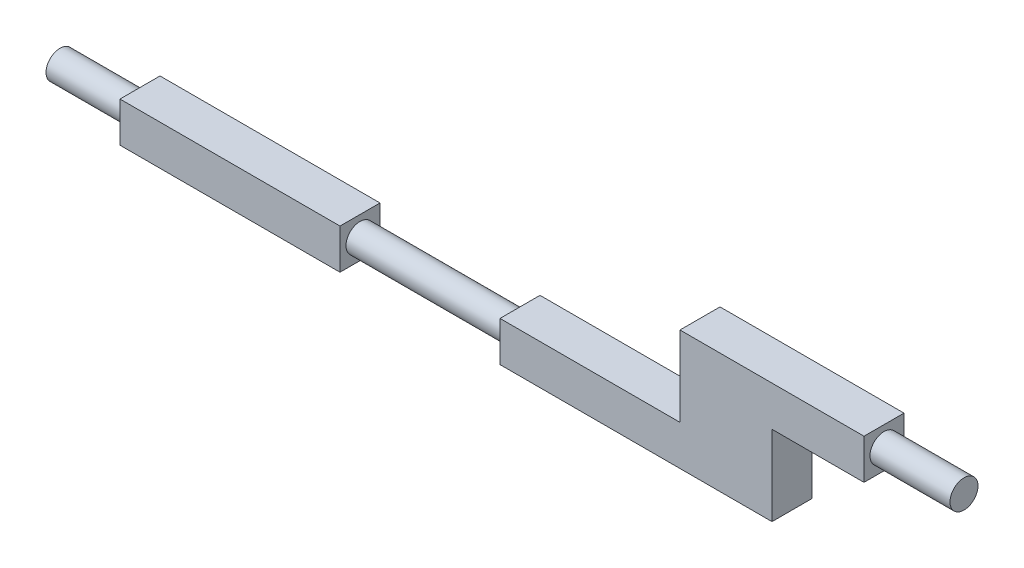
ISO-10303-21;
HEADER;
FILE_DESCRIPTION(('STEP AP214'),'2;1');
FILE_NAME('part.step','',(''),(''),'','','');
FILE_SCHEMA(('AUTOMOTIVE_DESIGN { 1 0 10303 214 1 1 1 1 }'));
ENDSEC;
DATA;
#1=APPLICATION_CONTEXT('core data for automotive mechanical design processes');
#2=APPLICATION_PROTOCOL_DEFINITION('international standard','automotive_design',2000,#1);
#3=PRODUCT_CONTEXT('',#1,'mechanical');
#4=PRODUCT('Part','Part','',(#3));
#5=PRODUCT_RELATED_PRODUCT_CATEGORY('part','',(#4));
#6=PRODUCT_DEFINITION_FORMATION('','',#4);
#7=PRODUCT_DEFINITION_CONTEXT('part definition',#1,'design');
#8=PRODUCT_DEFINITION('design','',#6,#7);
#9=PRODUCT_DEFINITION_SHAPE('','',#8);
#10=(LENGTH_UNIT() NAMED_UNIT(*) SI_UNIT(.MILLI.,.METRE.));
#11=(NAMED_UNIT(*) PLANE_ANGLE_UNIT() SI_UNIT($,.RADIAN.));
#12=(NAMED_UNIT(*) SI_UNIT($,.STERADIAN.) SOLID_ANGLE_UNIT());
#13=UNCERTAINTY_MEASURE_WITH_UNIT(LENGTH_MEASURE(1.E-05),#10,'distance_accuracy_value','');
#14=(GEOMETRIC_REPRESENTATION_CONTEXT(3) GLOBAL_UNCERTAINTY_ASSIGNED_CONTEXT((#13)) GLOBAL_UNIT_ASSIGNED_CONTEXT((#10,
#11,#12)) REPRESENTATION_CONTEXT('',''));
#15=CARTESIAN_POINT('',(0.,0.,0.));
#16=DIRECTION('',(0.,0.,1.));
#17=DIRECTION('',(1.,0.,0.));
#18=AXIS2_PLACEMENT_3D('',#15,#16,#17);
#19=CARTESIAN_POINT('',(-206.,-30.,10.));
#20=DIRECTION('',(-1.,0.,0.));
#21=DIRECTION('',(0.,0.,1.));
#22=AXIS2_PLACEMENT_3D('',#19,#20,#21);
#23=PLANE('',#22);
#24=CARTESIAN_POINT('',(-206.,-25.,5.));
#25=DIRECTION('',(-1.,0.,0.));
#26=DIRECTION('',(0.,0.,1.));
#27=AXIS2_PLACEMENT_3D('',#24,#25,#26);
#28=CIRCLE('',#27,3.5);
#29=CARTESIAN_POINT('',(-206.,-25.,8.5));
#30=VERTEX_POINT('',#29);
#31=EDGE_CURVE('E141',#30,#30,#28,.T.);
#32=ORIENTED_EDGE('',*,*,#31,.F.);
#33=EDGE_LOOP('',(#32));
#34=FACE_BOUND('',#33,.T.);
#35=DIRECTION('',(0.,1.,0.));
#36=VECTOR('',#35,1.);
#37=CARTESIAN_POINT('',(-206.,-30.,10.));
#38=LINE('',#37,#36);
#39=CARTESIAN_POINT('',(-206.,-30.,10.));
#40=VERTEX_POINT('',#39);
#41=CARTESIAN_POINT('',(-206.,-20.,10.));
#42=VERTEX_POINT('',#41);
#43=EDGE_CURVE('E140',#40,#42,#38,.T.);
#44=ORIENTED_EDGE('',*,*,#43,.T.);
#45=DIRECTION('',(0.,0.,-1.));
#46=VECTOR('',#45,1.);
#47=CARTESIAN_POINT('',(-206.,-20.,10.));
#48=LINE('',#47,#46);
#49=CARTESIAN_POINT('',(-206.,-20.,0.));
#50=VERTEX_POINT('',#49);
#51=EDGE_CURVE('E127',#42,#50,#48,.T.);
#52=ORIENTED_EDGE('',*,*,#51,.T.);
#53=DIRECTION('',(0.,1.,0.));
#54=VECTOR('',#53,1.);
#55=CARTESIAN_POINT('',(-206.,-30.,0.));
#56=LINE('',#55,#54);
#57=CARTESIAN_POINT('',(-206.,-30.,0.));
#58=VERTEX_POINT('',#57);
#59=EDGE_CURVE('E139',#58,#50,#56,.T.);
#60=ORIENTED_EDGE('',*,*,#59,.F.);
#61=DIRECTION('',(0.,0.,-1.));
#62=VECTOR('',#61,1.);
#63=CARTESIAN_POINT('',(-206.,-30.,10.));
#64=LINE('',#63,#62);
#65=EDGE_CURVE('E11',#40,#58,#64,.T.);
#66=ORIENTED_EDGE('',*,*,#65,.F.);
#67=EDGE_LOOP('',(#44,#52,#60,#66));
#68=FACE_BOUND('',#67,.T.);
#69=ADVANCED_FACE('F32',(#34,#68),#23,.T.);
#70=CARTESIAN_POINT('',(0.,0.,0.));
#71=DIRECTION('',(0.,0.,-1.));
#72=DIRECTION('',(-1.,0.,0.));
#73=AXIS2_PLACEMENT_3D('',#70,#71,#72);
#74=PLANE('',#73);
#75=ORIENTED_EDGE('',*,*,#59,.T.);
#76=DIRECTION('',(1.,0.,0.));
#77=VECTOR('',#76,1.);
#78=CARTESIAN_POINT('',(-196.,-20.,0.));
#79=LINE('',#78,#77);
#80=CARTESIAN_POINT('',(-151.,-20.,0.));
#81=VERTEX_POINT('',#80);
#82=EDGE_CURVE('E125',#50,#81,#79,.T.);
#83=ORIENTED_EDGE('',*,*,#82,.T.);
#84=DIRECTION('',(0.,1.,0.));
#85=VECTOR('',#84,1.);
#86=CARTESIAN_POINT('',(-151.,-30.,0.));
#87=LINE('',#86,#85);
#88=CARTESIAN_POINT('',(-151.,-30.,0.));
#89=VERTEX_POINT('',#88);
#90=EDGE_CURVE('E328',#89,#81,#87,.T.);
#91=ORIENTED_EDGE('',*,*,#90,.F.);
#92=DIRECTION('',(-1.,0.,0.));
#93=VECTOR('',#92,1.);
#94=CARTESIAN_POINT('',(-43.0000000000001,-30.,0.));
#95=LINE('',#94,#93);
#96=EDGE_CURVE('E145',#89,#58,#95,.T.);
#97=ORIENTED_EDGE('',*,*,#96,.T.);
#98=EDGE_LOOP('',(#75,#83,#91,#97));
#99=FACE_BOUND('',#98,.T.);
#100=ADVANCED_FACE('F143',(#99),#74,.T.);
#101=CARTESIAN_POINT('',(0.,0.,10.));
#102=DIRECTION('',(0.,0.,-1.));
#103=DIRECTION('',(-1.,0.,0.));
#104=AXIS2_PLACEMENT_3D('',#101,#102,#103);
#105=PLANE('',#104);
#106=DIRECTION('',(1.,0.,0.));
#107=VECTOR('',#106,1.);
#108=CARTESIAN_POINT('',(-196.,-20.,10.));
#109=LINE('',#108,#107);
#110=CARTESIAN_POINT('',(-151.,-20.,10.));
#111=VERTEX_POINT('',#110);
#112=EDGE_CURVE('E49',#42,#111,#109,.T.);
#113=ORIENTED_EDGE('',*,*,#112,.F.);
#114=ORIENTED_EDGE('',*,*,#43,.F.);
#115=DIRECTION('',(-1.,0.,0.));
#116=VECTOR('',#115,1.);
#117=CARTESIAN_POINT('',(-43.0000000000001,-30.,10.));
#118=LINE('',#117,#116);
#119=CARTESIAN_POINT('',(-151.,-30.,10.));
#120=VERTEX_POINT('',#119);
#121=EDGE_CURVE('E168',#120,#40,#118,.T.);
#122=ORIENTED_EDGE('',*,*,#121,.F.);
#123=DIRECTION('',(0.,-1.,0.));
#124=VECTOR('',#123,1.);
#125=CARTESIAN_POINT('',(-151.,-30.,10.));
#126=LINE('',#125,#124);
#127=EDGE_CURVE('E207',#111,#120,#126,.T.);
#128=ORIENTED_EDGE('',*,*,#127,.F.);
#129=EDGE_LOOP('',(#113,#114,#122,#128));
#130=FACE_BOUND('',#129,.T.);
#131=ADVANCED_FACE('F231',(#130),#105,.F.);
#132=DIRECTION('',(0.,-1.,0.));
#133=VECTOR('',#132,1.);
#134=CARTESIAN_POINT('',(-111.,-30.,10.));
#135=LINE('',#134,#133);
#136=CARTESIAN_POINT('',(-111.,-20.,10.));
#137=VERTEX_POINT('',#136);
#138=CARTESIAN_POINT('',(-111.,-30.,10.));
#139=VERTEX_POINT('',#138);
#140=EDGE_CURVE('E57',#137,#139,#135,.T.);
#141=ORIENTED_EDGE('',*,*,#140,.T.);
#142=CARTESIAN_POINT('',(-43.0000000000001,-30.,10.));
#143=VERTEX_POINT('',#142);
#144=EDGE_CURVE('E165',#143,#139,#118,.T.);
#145=ORIENTED_EDGE('',*,*,#144,.F.);
#146=DIRECTION('',(0.,-1.,0.));
#147=VECTOR('',#146,1.);
#148=CARTESIAN_POINT('',(-43.0000000000001,-10.,10.));
#149=LINE('',#148,#147);
#150=CARTESIAN_POINT('',(-43.0000000000001,-10.,10.));
#151=VERTEX_POINT('',#150);
#152=EDGE_CURVE('E192',#151,#143,#149,.T.);
#153=ORIENTED_EDGE('',*,*,#152,.F.);
#154=DIRECTION('',(-1.,0.,0.));
#155=VECTOR('',#154,1.);
#156=CARTESIAN_POINT('',(0.,-10.,10.));
#157=LINE('',#156,#155);
#158=CARTESIAN_POINT('',(-20.,-10.,10.));
#159=VERTEX_POINT('',#158);
#160=EDGE_CURVE('E225',#159,#151,#157,.T.);
#161=ORIENTED_EDGE('',*,*,#160,.F.);
#162=DIRECTION('',(0.,-1.,0.));
#163=VECTOR('',#162,1.);
#164=CARTESIAN_POINT('',(-20.,0.,10.));
#165=LINE('',#164,#163);
#166=CARTESIAN_POINT('',(-20.,0.,10.));
#167=VERTEX_POINT('',#166);
#168=EDGE_CURVE('E211',#167,#159,#165,.T.);
#169=ORIENTED_EDGE('',*,*,#168,.F.);
#170=DIRECTION('',(1.,0.,0.));
#171=VECTOR('',#170,1.);
#172=CARTESIAN_POINT('',(-66.,0.,10.));
#173=LINE('',#172,#171);
#174=CARTESIAN_POINT('',(-66.,0.,10.));
#175=VERTEX_POINT('',#174);
#176=EDGE_CURVE('E222',#175,#167,#173,.T.);
#177=ORIENTED_EDGE('',*,*,#176,.F.);
#178=DIRECTION('',(0.,1.,0.));
#179=VECTOR('',#178,1.);
#180=CARTESIAN_POINT('',(-66.,-20.,10.));
#181=LINE('',#180,#179);
#182=CARTESIAN_POINT('',(-66.,-20.,10.));
#183=VERTEX_POINT('',#182);
#184=EDGE_CURVE('E219',#183,#175,#181,.T.);
#185=ORIENTED_EDGE('',*,*,#184,.F.);
#186=EDGE_CURVE('E146',#137,#183,#109,.T.);
#187=ORIENTED_EDGE('',*,*,#186,.F.);
#188=EDGE_LOOP('',(#141,#145,#153,#161,#169,#177,#185,#187));
#189=FACE_BOUND('',#188,.T.);
#190=ADVANCED_FACE('F233',(#189),#105,.F.);
#191=CARTESIAN_POINT('',(-43.0000000000001,-30.,0.));
#192=VERTEX_POINT('',#191);
#193=CARTESIAN_POINT('',(-111.,-30.,0.));
#194=VERTEX_POINT('',#193);
#195=EDGE_CURVE('E147',#192,#194,#95,.T.);
#196=ORIENTED_EDGE('',*,*,#195,.T.);
#197=DIRECTION('',(0.,1.,0.));
#198=VECTOR('',#197,1.);
#199=CARTESIAN_POINT('',(-111.,-30.,0.));
#200=LINE('',#199,#198);
#201=CARTESIAN_POINT('',(-111.,-20.,0.));
#202=VERTEX_POINT('',#201);
#203=EDGE_CURVE('E198',#194,#202,#200,.T.);
#204=ORIENTED_EDGE('',*,*,#203,.T.);
#205=CARTESIAN_POINT('',(-66.,-20.,0.));
#206=VERTEX_POINT('',#205);
#207=EDGE_CURVE('E134',#202,#206,#79,.T.);
#208=ORIENTED_EDGE('',*,*,#207,.T.);
#209=DIRECTION('',(0.,1.,0.));
#210=VECTOR('',#209,1.);
#211=CARTESIAN_POINT('',(-66.,-20.,0.));
#212=LINE('',#211,#210);
#213=CARTESIAN_POINT('',(-66.,0.,0.));
#214=VERTEX_POINT('',#213);
#215=EDGE_CURVE('E133',#206,#214,#212,.T.);
#216=ORIENTED_EDGE('',*,*,#215,.T.);
#217=DIRECTION('',(1.,0.,0.));
#218=VECTOR('',#217,1.);
#219=CARTESIAN_POINT('',(-66.,0.,0.));
#220=LINE('',#219,#218);
#221=CARTESIAN_POINT('',(-20.,0.,0.));
#222=VERTEX_POINT('',#221);
#223=EDGE_CURVE('E174',#214,#222,#220,.T.);
#224=ORIENTED_EDGE('',*,*,#223,.T.);
#225=DIRECTION('',(0.,1.,0.));
#226=VECTOR('',#225,1.);
#227=CARTESIAN_POINT('',(-20.,0.,0.));
#228=LINE('',#227,#226);
#229=CARTESIAN_POINT('',(-20.,-10.,0.));
#230=VERTEX_POINT('',#229);
#231=EDGE_CURVE('E215',#230,#222,#228,.T.);
#232=ORIENTED_EDGE('',*,*,#231,.F.);
#233=DIRECTION('',(-1.,0.,0.));
#234=VECTOR('',#233,1.);
#235=CARTESIAN_POINT('',(0.,-10.,0.));
#236=LINE('',#235,#234);
#237=CARTESIAN_POINT('',(-43.0000000000001,-10.,0.));
#238=VERTEX_POINT('',#237);
#239=EDGE_CURVE('E177',#230,#238,#236,.T.);
#240=ORIENTED_EDGE('',*,*,#239,.T.);
#241=DIRECTION('',(0.,-1.,0.));
#242=VECTOR('',#241,1.);
#243=CARTESIAN_POINT('',(-43.0000000000001,-10.,0.));
#244=LINE('',#243,#242);
#245=EDGE_CURVE('E178',#238,#192,#244,.T.);
#246=ORIENTED_EDGE('',*,*,#245,.T.);
#247=EDGE_LOOP('',(#196,#204,#208,#216,#224,#232,#240,#246));
#248=FACE_BOUND('',#247,.T.);
#249=ADVANCED_FACE('F182',(#248),#74,.T.);
#250=CARTESIAN_POINT('',(-43.0000000000001,-30.,10.));
#251=DIRECTION('',(0.,-1.,0.));
#252=DIRECTION('',(1.,0.,0.));
#253=AXIS2_PLACEMENT_3D('',#250,#251,#252);
#254=PLANE('',#253);
#255=ORIENTED_EDGE('',*,*,#144,.T.);
#256=DIRECTION('',(0.,0.,-1.));
#257=VECTOR('',#256,1.);
#258=CARTESIAN_POINT('',(-111.,-30.,10.));
#259=LINE('',#258,#257);
#260=EDGE_CURVE('E197',#139,#194,#259,.T.);
#261=ORIENTED_EDGE('',*,*,#260,.T.);
#262=ORIENTED_EDGE('',*,*,#195,.F.);
#263=DIRECTION('',(0.,0.,-1.));
#264=VECTOR('',#263,1.);
#265=CARTESIAN_POINT('',(-43.0000000000001,-30.,10.));
#266=LINE('',#265,#264);
#267=EDGE_CURVE('E41',#143,#192,#266,.T.);
#268=ORIENTED_EDGE('',*,*,#267,.F.);
#269=EDGE_LOOP('',(#255,#261,#262,#268));
#270=FACE_BOUND('',#269,.T.);
#271=ADVANCED_FACE('F196',(#270),#254,.T.);
#272=CARTESIAN_POINT('',(-196.,-20.,10.));
#273=DIRECTION('',(0.,1.,0.));
#274=DIRECTION('',(-1.,0.,0.));
#275=AXIS2_PLACEMENT_3D('',#272,#273,#274);
#276=PLANE('',#275);
#277=ORIENTED_EDGE('',*,*,#207,.F.);
#278=DIRECTION('',(0.,0.,1.));
#279=VECTOR('',#278,1.);
#280=CARTESIAN_POINT('',(-111.,-20.,10.));
#281=LINE('',#280,#279);
#282=EDGE_CURVE('E200',#202,#137,#281,.T.);
#283=ORIENTED_EDGE('',*,*,#282,.T.);
#284=ORIENTED_EDGE('',*,*,#186,.T.);
#285=DIRECTION('',(0.,0.,-1.));
#286=VECTOR('',#285,1.);
#287=CARTESIAN_POINT('',(-66.,-20.,10.));
#288=LINE('',#287,#286);
#289=EDGE_CURVE('E159',#183,#206,#288,.T.);
#290=ORIENTED_EDGE('',*,*,#289,.T.);
#291=EDGE_LOOP('',(#277,#283,#284,#290));
#292=FACE_BOUND('',#291,.T.);
#293=ADVANCED_FACE('F259',(#292),#276,.T.);
#294=CARTESIAN_POINT('',(0.,-10.,10.));
#295=DIRECTION('',(0.,-1.,0.));
#296=DIRECTION('',(1.,0.,0.));
#297=AXIS2_PLACEMENT_3D('',#294,#295,#296);
#298=PLANE('',#297);
#299=ORIENTED_EDGE('',*,*,#239,.F.);
#300=DIRECTION('',(0.,0.,-1.));
#301=VECTOR('',#300,1.);
#302=CARTESIAN_POINT('',(-20.,-10.,10.));
#303=LINE('',#302,#301);
#304=EDGE_CURVE('E213',#159,#230,#303,.T.);
#305=ORIENTED_EDGE('',*,*,#304,.F.);
#306=ORIENTED_EDGE('',*,*,#160,.T.);
#307=DIRECTION('',(0.,0.,-1.));
#308=VECTOR('',#307,1.);
#309=CARTESIAN_POINT('',(-43.0000000000001,-10.,10.));
#310=LINE('',#309,#308);
#311=EDGE_CURVE('E155',#151,#238,#310,.T.);
#312=ORIENTED_EDGE('',*,*,#311,.T.);
#313=EDGE_LOOP('',(#299,#305,#306,#312));
#314=FACE_BOUND('',#313,.T.);
#315=ADVANCED_FACE('F256',(#314),#298,.T.);
#316=CARTESIAN_POINT('',(-66.,0.,10.));
#317=DIRECTION('',(0.,1.,0.));
#318=DIRECTION('',(-1.,0.,0.));
#319=AXIS2_PLACEMENT_3D('',#316,#317,#318);
#320=PLANE('',#319);
#321=ORIENTED_EDGE('',*,*,#176,.T.);
#322=DIRECTION('',(0.,0.,1.));
#323=VECTOR('',#322,1.);
#324=CARTESIAN_POINT('',(-20.,0.,10.));
#325=LINE('',#324,#323);
#326=EDGE_CURVE('E217',#222,#167,#325,.T.);
#327=ORIENTED_EDGE('',*,*,#326,.F.);
#328=ORIENTED_EDGE('',*,*,#223,.F.);
#329=DIRECTION('',(0.,0.,-1.));
#330=VECTOR('',#329,1.);
#331=CARTESIAN_POINT('',(-66.,0.,10.));
#332=LINE('',#331,#330);
#333=EDGE_CURVE('E158',#175,#214,#332,.T.);
#334=ORIENTED_EDGE('',*,*,#333,.F.);
#335=EDGE_LOOP('',(#321,#327,#328,#334));
#336=FACE_BOUND('',#335,.T.);
#337=ADVANCED_FACE('F255',(#336),#320,.T.);
#338=CARTESIAN_POINT('',(-43.0000000000001,-10.,10.));
#339=DIRECTION('',(1.,0.,0.));
#340=DIRECTION('',(0.,1.,0.));
#341=AXIS2_PLACEMENT_3D('',#338,#339,#340);
#342=PLANE('',#341);
#343=ORIENTED_EDGE('',*,*,#245,.F.);
#344=ORIENTED_EDGE('',*,*,#311,.F.);
#345=ORIENTED_EDGE('',*,*,#152,.T.);
#346=ORIENTED_EDGE('',*,*,#267,.T.);
#347=EDGE_LOOP('',(#343,#344,#345,#346));
#348=FACE_BOUND('',#347,.T.);
#349=ADVANCED_FACE('F189',(#348),#342,.T.);
#350=CARTESIAN_POINT('',(-66.,-20.,10.));
#351=DIRECTION('',(-1.,0.,0.));
#352=DIRECTION('',(0.,0.,1.));
#353=AXIS2_PLACEMENT_3D('',#350,#351,#352);
#354=PLANE('',#353);
#355=ORIENTED_EDGE('',*,*,#215,.F.);
#356=ORIENTED_EDGE('',*,*,#289,.F.);
#357=ORIENTED_EDGE('',*,*,#184,.T.);
#358=ORIENTED_EDGE('',*,*,#333,.T.);
#359=EDGE_LOOP('',(#355,#356,#357,#358));
#360=FACE_BOUND('',#359,.T.);
#361=ADVANCED_FACE('F254',(#360),#354,.T.);
#362=CARTESIAN_POINT('',(-20.,0.,0.));
#363=DIRECTION('',(1.,0.,0.));
#364=DIRECTION('',(0.,0.,-1.));
#365=AXIS2_PLACEMENT_3D('',#362,#363,#364);
#366=PLANE('',#365);
#367=CARTESIAN_POINT('',(-20.,-5.,5.));
#368=DIRECTION('',(1.,0.,0.));
#369=DIRECTION('',(0.,0.,-1.));
#370=AXIS2_PLACEMENT_3D('',#367,#368,#369);
#371=CIRCLE('',#370,3.50000000000019);
#372=CARTESIAN_POINT('',(-20.,-5.,1.49999999999981));
#373=VERTEX_POINT('',#372);
#374=EDGE_CURVE('E208',#373,#373,#371,.T.);
#375=ORIENTED_EDGE('',*,*,#374,.F.);
#376=EDGE_LOOP('',(#375));
#377=FACE_BOUND('',#376,.T.);
#378=ORIENTED_EDGE('',*,*,#168,.T.);
#379=ORIENTED_EDGE('',*,*,#304,.T.);
#380=ORIENTED_EDGE('',*,*,#231,.T.);
#381=ORIENTED_EDGE('',*,*,#326,.T.);
#382=EDGE_LOOP('',(#378,#379,#380,#381));
#383=FACE_BOUND('',#382,.T.);
#384=ADVANCED_FACE('F270',(#377,#383),#366,.T.);
#385=CARTESIAN_POINT('',(-20.,-5.,5.));
#386=DIRECTION('',(1.,0.,0.));
#387=DIRECTION('',(0.,0.,-1.));
#388=AXIS2_PLACEMENT_3D('',#385,#386,#387);
#389=CYLINDRICAL_SURFACE('',#388,3.50000000000019);
#390=CARTESIAN_POINT('',(0.,-5.,5.));
#391=DIRECTION('',(1.,0.,0.));
#392=DIRECTION('',(0.,1.,0.));
#393=AXIS2_PLACEMENT_3D('',#390,#391,#392);
#394=CIRCLE('',#393,3.50000000000019);
#395=CARTESIAN_POINT('',(0.,-1.49999999999981,5.));
#396=VERTEX_POINT('',#395);
#397=EDGE_CURVE('E36',#396,#396,#394,.T.);
#398=ORIENTED_EDGE('',*,*,#397,.F.);
#399=EDGE_LOOP('',(#398));
#400=FACE_BOUND('',#399,.T.);
#401=ORIENTED_EDGE('',*,*,#374,.T.);
#402=EDGE_LOOP('',(#401));
#403=FACE_BOUND('',#402,.T.);
#404=ADVANCED_FACE('F265',(#400,#403),#389,.T.);
#405=CARTESIAN_POINT('',(0.,0.,10.));
#406=DIRECTION('',(1.,0.,0.));
#407=DIRECTION('',(0.,1.,0.));
#408=AXIS2_PLACEMENT_3D('',#405,#406,#407);
#409=PLANE('',#408);
#410=ORIENTED_EDGE('',*,*,#397,.T.);
#411=EDGE_LOOP('',(#410));
#412=FACE_BOUND('',#411,.T.);
#413=ADVANCED_FACE('F261',(#412),#409,.T.);
#414=CARTESIAN_POINT('',(-151.,0.,0.));
#415=DIRECTION('',(-1.,0.,0.));
#416=DIRECTION('',(0.,0.,1.));
#417=AXIS2_PLACEMENT_3D('',#414,#415,#416);
#418=PLANE('',#417);
#419=CARTESIAN_POINT('',(-151.,-25.,5.));
#420=DIRECTION('',(1.,0.,0.));
#421=DIRECTION('',(0.,0.,-1.));
#422=AXIS2_PLACEMENT_3D('',#419,#420,#421);
#423=CIRCLE('',#422,3.5);
#424=CARTESIAN_POINT('',(-151.,-25.,1.5));
#425=VERTEX_POINT('',#424);
#426=EDGE_CURVE('E202',#425,#425,#423,.T.);
#427=ORIENTED_EDGE('',*,*,#426,.F.);
#428=EDGE_LOOP('',(#427));
#429=FACE_BOUND('',#428,.T.);
#430=ORIENTED_EDGE('',*,*,#127,.T.);
#431=DIRECTION('',(0.,0.,-1.));
#432=VECTOR('',#431,1.);
#433=CARTESIAN_POINT('',(-151.,-30.,10.));
#434=LINE('',#433,#432);
#435=EDGE_CURVE('E230',#120,#89,#434,.T.);
#436=ORIENTED_EDGE('',*,*,#435,.T.);
#437=ORIENTED_EDGE('',*,*,#90,.T.);
#438=DIRECTION('',(0.,0.,1.));
#439=VECTOR('',#438,1.);
#440=CARTESIAN_POINT('',(-151.,-20.,10.));
#441=LINE('',#440,#439);
#442=EDGE_CURVE('E129',#81,#111,#441,.T.);
#443=ORIENTED_EDGE('',*,*,#442,.T.);
#444=EDGE_LOOP('',(#430,#436,#437,#443));
#445=FACE_BOUND('',#444,.T.);
#446=ADVANCED_FACE('F264',(#429,#445),#418,.F.);
#447=CARTESIAN_POINT('',(-111.,0.,0.));
#448=DIRECTION('',(-1.,0.,0.));
#449=DIRECTION('',(0.,0.,1.));
#450=AXIS2_PLACEMENT_3D('',#447,#448,#449);
#451=PLANE('',#450);
#452=CARTESIAN_POINT('',(-111.,-25.,5.));
#453=DIRECTION('',(1.,0.,0.));
#454=DIRECTION('',(0.,0.,-1.));
#455=AXIS2_PLACEMENT_3D('',#452,#453,#454);
#456=CIRCLE('',#455,3.5);
#457=CARTESIAN_POINT('',(-111.,-25.,1.5));
#458=VERTEX_POINT('',#457);
#459=EDGE_CURVE('E318',#458,#458,#456,.T.);
#460=ORIENTED_EDGE('',*,*,#459,.T.);
#461=EDGE_LOOP('',(#460));
#462=FACE_BOUND('',#461,.T.);
#463=ORIENTED_EDGE('',*,*,#140,.F.);
#464=ORIENTED_EDGE('',*,*,#282,.F.);
#465=ORIENTED_EDGE('',*,*,#203,.F.);
#466=ORIENTED_EDGE('',*,*,#260,.F.);
#467=EDGE_LOOP('',(#463,#464,#465,#466));
#468=FACE_BOUND('',#467,.T.);
#469=ADVANCED_FACE('F292',(#462,#468),#451,.T.);
#470=CARTESIAN_POINT('',(-151.,-25.,5.));
#471=DIRECTION('',(1.,0.,0.));
#472=DIRECTION('',(0.,0.,-1.));
#473=AXIS2_PLACEMENT_3D('',#470,#471,#472);
#474=CYLINDRICAL_SURFACE('',#473,3.5);
#475=ORIENTED_EDGE('',*,*,#426,.T.);
#476=EDGE_LOOP('',(#475));
#477=FACE_BOUND('',#476,.T.);
#478=ORIENTED_EDGE('',*,*,#459,.F.);
#479=EDGE_LOOP('',(#478));
#480=FACE_BOUND('',#479,.T.);
#481=ADVANCED_FACE('F294',(#477,#480),#474,.T.);
#482=ORIENTED_EDGE('',*,*,#442,.F.);
#483=ORIENTED_EDGE('',*,*,#82,.F.);
#484=ORIENTED_EDGE('',*,*,#51,.F.);
#485=ORIENTED_EDGE('',*,*,#112,.T.);
#486=EDGE_LOOP('',(#482,#483,#484,#485));
#487=FACE_BOUND('',#486,.T.);
#488=ADVANCED_FACE('F34',(#487),#276,.T.);
#489=ORIENTED_EDGE('',*,*,#435,.F.);
#490=ORIENTED_EDGE('',*,*,#121,.T.);
#491=ORIENTED_EDGE('',*,*,#65,.T.);
#492=ORIENTED_EDGE('',*,*,#96,.F.);
#493=EDGE_LOOP('',(#489,#490,#491,#492));
#494=FACE_BOUND('',#493,.T.);
#495=ADVANCED_FACE('F229',(#494),#254,.T.);
#496=CARTESIAN_POINT('',(-226.,-25.,5.));
#497=DIRECTION('',(1.,0.,0.));
#498=DIRECTION('',(0.,0.,-1.));
#499=AXIS2_PLACEMENT_3D('',#496,#497,#498);
#500=CYLINDRICAL_SURFACE('',#499,3.5);
#501=CARTESIAN_POINT('',(-226.,-25.,5.));
#502=DIRECTION('',(-1.,0.,0.));
#503=DIRECTION('',(0.,0.,1.));
#504=AXIS2_PLACEMENT_3D('',#501,#502,#503);
#505=CIRCLE('',#504,3.5);
#506=CARTESIAN_POINT('',(-226.,-25.,8.5));
#507=VERTEX_POINT('',#506);
#508=EDGE_CURVE('E317',#507,#507,#505,.T.);
#509=ORIENTED_EDGE('',*,*,#508,.F.);
#510=EDGE_LOOP('',(#509));
#511=FACE_BOUND('',#510,.T.);
#512=ORIENTED_EDGE('',*,*,#31,.T.);
#513=EDGE_LOOP('',(#512));
#514=FACE_BOUND('',#513,.T.);
#515=ADVANCED_FACE('F251',(#511,#514),#500,.T.);
#516=CARTESIAN_POINT('',(-226.,-25.,5.));
#517=DIRECTION('',(-1.,0.,0.));
#518=DIRECTION('',(0.,0.,1.));
#519=AXIS2_PLACEMENT_3D('',#516,#517,#518);
#520=PLANE('',#519);
#521=ORIENTED_EDGE('',*,*,#508,.T.);
#522=EDGE_LOOP('',(#521));
#523=FACE_BOUND('',#522,.T.);
#524=ADVANCED_FACE('F309',(#523),#520,.T.);
#525=CLOSED_SHELL('',(#69,#100,#131,#190,#249,#271,#293,#315,#337,#349,#361,#384,#404,#413,#446,
#469,#481,#488,#495,#515,#524));
#526=MANIFOLD_SOLID_BREP('B2',#525);
#527=ADVANCED_BREP_SHAPE_REPRESENTATION('',(#18,#526),#14);
#528=SHAPE_DEFINITION_REPRESENTATION(#9,#527);
ENDSEC;
END-ISO-10303-21;
